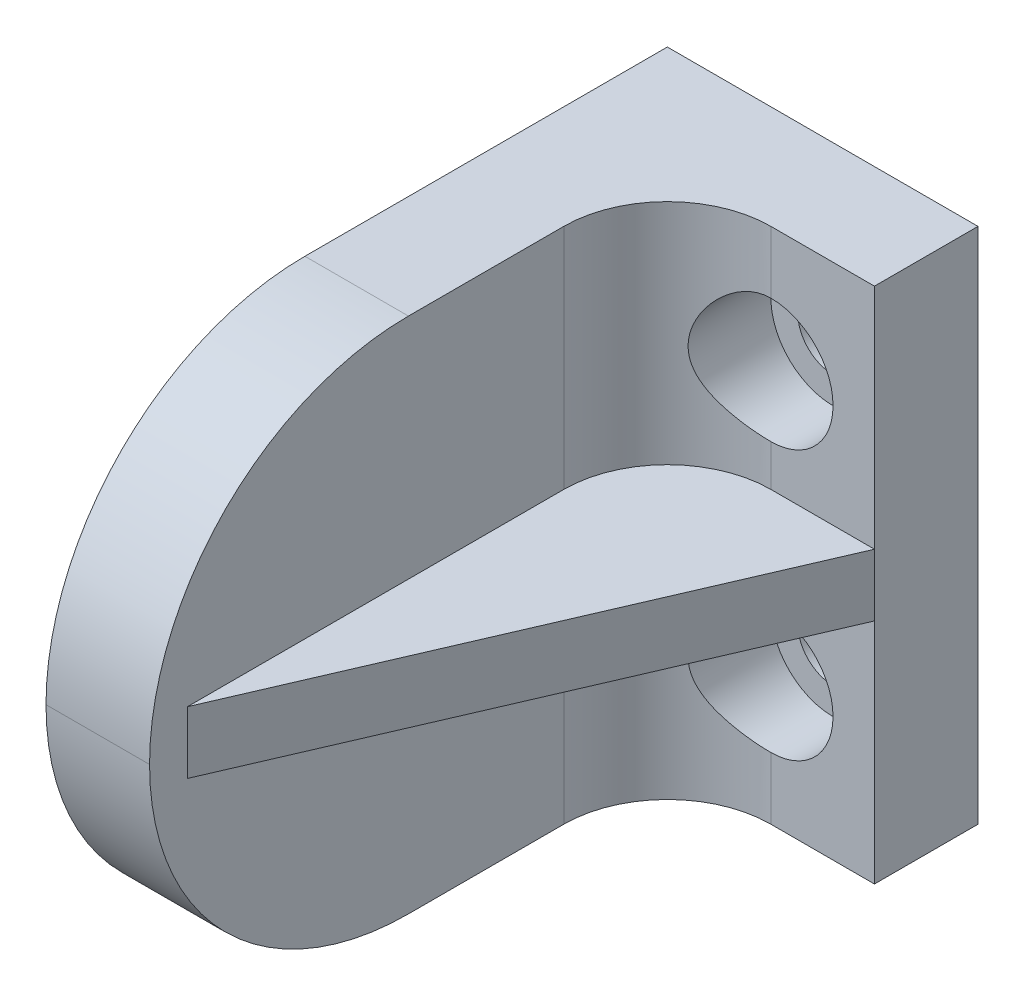
ISO-10303-21;
HEADER;
FILE_DESCRIPTION(('STEP AP214'),'2;1');
FILE_NAME('part.step','',(''),(''),'','','');
FILE_SCHEMA(('AUTOMOTIVE_DESIGN { 1 0 10303 214 1 1 1 1 }'));
ENDSEC;
DATA;
#1=APPLICATION_CONTEXT('core data for automotive mechanical design processes');
#2=APPLICATION_PROTOCOL_DEFINITION('international standard','automotive_design',2000,#1);
#3=PRODUCT_CONTEXT('',#1,'mechanical');
#4=PRODUCT('Part','Part','',(#3));
#5=PRODUCT_RELATED_PRODUCT_CATEGORY('part','',(#4));
#6=PRODUCT_DEFINITION_FORMATION('','',#4);
#7=PRODUCT_DEFINITION_CONTEXT('part definition',#1,'design');
#8=PRODUCT_DEFINITION('design','',#6,#7);
#9=PRODUCT_DEFINITION_SHAPE('','',#8);
#10=(LENGTH_UNIT() NAMED_UNIT(*) SI_UNIT(.MILLI.,.METRE.));
#11=(NAMED_UNIT(*) PLANE_ANGLE_UNIT() SI_UNIT($,.RADIAN.));
#12=(NAMED_UNIT(*) SI_UNIT($,.STERADIAN.) SOLID_ANGLE_UNIT());
#13=UNCERTAINTY_MEASURE_WITH_UNIT(LENGTH_MEASURE(1.E-05),#10,'distance_accuracy_value','');
#14=(GEOMETRIC_REPRESENTATION_CONTEXT(3) GLOBAL_UNCERTAINTY_ASSIGNED_CONTEXT((#13)) GLOBAL_UNIT_ASSIGNED_CONTEXT((#10,
#11,#12)) REPRESENTATION_CONTEXT('',''));
#15=CARTESIAN_POINT('',(0.,0.,0.));
#16=DIRECTION('',(0.,0.,1.));
#17=DIRECTION('',(1.,0.,0.));
#18=AXIS2_PLACEMENT_3D('',#15,#16,#17);
#19=CARTESIAN_POINT('',(0.,0.,5.));
#20=DIRECTION('',(0.,0.,1.));
#21=DIRECTION('',(1.,0.,0.));
#22=AXIS2_PLACEMENT_3D('',#19,#20,#21);
#23=PLANE('',#22);
#24=DIRECTION('',(1.,0.,0.));
#25=VECTOR('',#24,1.);
#26=CARTESIAN_POINT('',(7.05085742582333E-13,221.923622409626,5.));
#27=LINE('',#26,#25);
#28=CARTESIAN_POINT('',(259.023766162715,221.923622409625,5.));
#29=VERTEX_POINT('',#28);
#30=CARTESIAN_POINT('',(264.023766162715,221.923622409625,5.));
#31=VERTEX_POINT('',#30);
#32=EDGE_CURVE('E314',#29,#31,#27,.T.);
#33=ORIENTED_EDGE('',*,*,#32,.F.);
#34=DIRECTION('',(0.,-1.,0.));
#35=VECTOR('',#34,1.);
#36=CARTESIAN_POINT('',(259.023766162715,0.,5.));
#37=LINE('',#36,#35);
#38=CARTESIAN_POINT('',(259.023766162715,219.923622409626,5.));
#39=VERTEX_POINT('',#38);
#40=EDGE_CURVE('E235',#29,#39,#37,.T.);
#41=ORIENTED_EDGE('',*,*,#40,.T.);
#42=CARTESIAN_POINT('',(259.023766162715,216.923622409626,5.));
#43=DIRECTION('',(0.,0.,1.));
#44=DIRECTION('',(1.,0.,0.));
#45=AXIS2_PLACEMENT_3D('',#42,#43,#44);
#46=CIRCLE('',#45,2.99999999999999);
#47=CARTESIAN_POINT('',(259.023766162715,213.923622409626,5.));
#48=VERTEX_POINT('',#47);
#49=EDGE_CURVE('E348',#48,#39,#46,.T.);
#50=ORIENTED_EDGE('',*,*,#49,.F.);
#51=DIRECTION('',(0.,-1.,0.));
#52=VECTOR('',#51,1.);
#53=CARTESIAN_POINT('',(259.023766162715,0.,5.));
#54=LINE('',#53,#52);
#55=CARTESIAN_POINT('',(259.023766162715,210.923622409626,5.));
#56=VERTEX_POINT('',#55);
#57=EDGE_CURVE('E52',#48,#56,#54,.T.);
#58=ORIENTED_EDGE('',*,*,#57,.T.);
#59=DIRECTION('',(-1.,0.,0.));
#60=VECTOR('',#59,1.);
#61=CARTESIAN_POINT('',(0.,210.923622409626,5.));
#62=LINE('',#61,#60);
#63=CARTESIAN_POINT('',(264.023766162715,210.923622409626,5.));
#64=VERTEX_POINT('',#63);
#65=EDGE_CURVE('E182',#64,#56,#62,.T.);
#66=ORIENTED_EDGE('',*,*,#65,.F.);
#67=DIRECTION('',(0.,1.,0.));
#68=VECTOR('',#67,1.);
#69=CARTESIAN_POINT('',(264.023766162715,0.,5.));
#70=LINE('',#69,#68);
#71=EDGE_CURVE('E186',#64,#31,#70,.T.);
#72=ORIENTED_EDGE('',*,*,#71,.T.);
#73=EDGE_LOOP('',(#33,#41,#50,#58,#66,#72));
#74=FACE_BOUND('',#73,.T.);
#75=ADVANCED_FACE('F36',(#74),#23,.T.);
#76=CARTESIAN_POINT('',(259.023766162715,216.923622409626,5.));
#77=DIRECTION('',(0.,0.,-1.));
#78=DIRECTION('',(-1.,0.,0.));
#79=AXIS2_PLACEMENT_3D('',#76,#77,#78);
#80=CYLINDRICAL_SURFACE('',#79,1.69999999999996);
#81=CARTESIAN_POINT('',(259.023766162715,216.923622409626,0.));
#82=DIRECTION('',(0.,0.,1.));
#83=DIRECTION('',(1.,0.,0.));
#84=AXIS2_PLACEMENT_3D('',#81,#82,#83);
#85=CIRCLE('',#84,1.69999999999996);
#86=CARTESIAN_POINT('',(260.723766162715,216.923622409626,0.));
#87=VERTEX_POINT('',#86);
#88=EDGE_CURVE('E154',#87,#87,#85,.T.);
#89=ORIENTED_EDGE('',*,*,#88,.F.);
#90=EDGE_LOOP('',(#89));
#91=FACE_BOUND('',#90,.T.);
#92=CARTESIAN_POINT('',(259.023766162715,216.923622409626,2.));
#93=DIRECTION('',(0.,0.,1.));
#94=DIRECTION('',(1.,0.,0.));
#95=AXIS2_PLACEMENT_3D('',#92,#93,#94);
#96=CIRCLE('',#95,1.69999999999996);
#97=CARTESIAN_POINT('',(260.723766162715,216.923622409626,2.));
#98=VERTEX_POINT('',#97);
#99=EDGE_CURVE('E202',#98,#98,#96,.T.);
#100=ORIENTED_EDGE('',*,*,#99,.T.);
#101=EDGE_LOOP('',(#100));
#102=FACE_BOUND('',#101,.T.);
#103=ADVANCED_FACE('F270',(#91,#102),#80,.F.);
#104=CARTESIAN_POINT('',(259.023766162715,229.923622409626,5.));
#105=DIRECTION('',(0.,0.,-1.));
#106=DIRECTION('',(-1.,0.,0.));
#107=AXIS2_PLACEMENT_3D('',#104,#105,#106);
#108=CYLINDRICAL_SURFACE('',#107,1.69999999999996);
#109=CARTESIAN_POINT('',(259.023766162715,229.923622409626,0.));
#110=DIRECTION('',(0.,0.,1.));
#111=DIRECTION('',(1.,0.,0.));
#112=AXIS2_PLACEMENT_3D('',#109,#110,#111);
#113=CIRCLE('',#112,1.69999999999996);
#114=CARTESIAN_POINT('',(260.723766162715,229.923622409626,0.));
#115=VERTEX_POINT('',#114);
#116=EDGE_CURVE('E163',#115,#115,#113,.T.);
#117=ORIENTED_EDGE('',*,*,#116,.F.);
#118=EDGE_LOOP('',(#117));
#119=FACE_BOUND('',#118,.T.);
#120=CARTESIAN_POINT('',(259.023766162715,229.923622409626,2.));
#121=DIRECTION('',(0.,0.,1.));
#122=DIRECTION('',(1.,0.,0.));
#123=AXIS2_PLACEMENT_3D('',#120,#121,#122);
#124=CIRCLE('',#123,1.69999999999996);
#125=CARTESIAN_POINT('',(260.723766162715,229.923622409626,2.));
#126=VERTEX_POINT('',#125);
#127=EDGE_CURVE('E199',#126,#126,#124,.T.);
#128=ORIENTED_EDGE('',*,*,#127,.T.);
#129=EDGE_LOOP('',(#128));
#130=FACE_BOUND('',#129,.T.);
#131=ADVANCED_FACE('F267',(#119,#130),#108,.F.);
#132=CARTESIAN_POINT('',(0.,235.923622409626,5.));
#133=DIRECTION('',(0.,-1.,0.));
#134=DIRECTION('',(0.,0.,-1.));
#135=AXIS2_PLACEMENT_3D('',#132,#133,#134);
#136=PLANE('',#135);
#137=DIRECTION('',(0.,0.,1.));
#138=VECTOR('',#137,1.);
#139=CARTESIAN_POINT('',(249.023766162715,235.923622409626,0.));
#140=LINE('',#139,#138);
#141=CARTESIAN_POINT('',(249.023766162715,235.923622409626,0.));
#142=VERTEX_POINT('',#141);
#143=CARTESIAN_POINT('',(249.023766162715,235.923622409626,17.5));
#144=VERTEX_POINT('',#143);
#145=EDGE_CURVE('E146',#142,#144,#140,.T.);
#146=ORIENTED_EDGE('',*,*,#145,.T.);
#147=DIRECTION('',(1.,0.,0.));
#148=VECTOR('',#147,1.);
#149=CARTESIAN_POINT('',(254.023766162715,235.923622409626,17.5));
#150=LINE('',#149,#148);
#151=CARTESIAN_POINT('',(254.023766162715,235.923622409626,17.5));
#152=VERTEX_POINT('',#151);
#153=EDGE_CURVE('E216',#144,#152,#150,.T.);
#154=ORIENTED_EDGE('',*,*,#153,.T.);
#155=DIRECTION('',(0.,0.,1.));
#156=VECTOR('',#155,1.);
#157=CARTESIAN_POINT('',(254.023766162715,235.923622409626,0.));
#158=LINE('',#157,#156);
#159=CARTESIAN_POINT('',(254.023766162715,235.923622409626,10.));
#160=VERTEX_POINT('',#159);
#161=EDGE_CURVE('E170',#160,#152,#158,.T.);
#162=ORIENTED_EDGE('',*,*,#161,.F.);
#163=CARTESIAN_POINT('',(259.023766162715,235.923622409626,10.));
#164=DIRECTION('',(0.,-1.,0.));
#165=DIRECTION('',(0.,0.,-1.));
#166=AXIS2_PLACEMENT_3D('',#163,#164,#165);
#167=CIRCLE('',#166,5.);
#168=CARTESIAN_POINT('',(259.023766162715,235.923622409626,5.));
#169=VERTEX_POINT('',#168);
#170=EDGE_CURVE('E246',#160,#169,#167,.T.);
#171=ORIENTED_EDGE('',*,*,#170,.T.);
#172=DIRECTION('',(-1.,0.,0.));
#173=VECTOR('',#172,1.);
#174=CARTESIAN_POINT('',(0.,235.923622409626,5.));
#175=LINE('',#174,#173);
#176=CARTESIAN_POINT('',(264.023766162715,235.923622409626,5.));
#177=VERTEX_POINT('',#176);
#178=EDGE_CURVE('E179',#177,#169,#175,.T.);
#179=ORIENTED_EDGE('',*,*,#178,.F.);
#180=DIRECTION('',(0.,0.,-1.));
#181=VECTOR('',#180,1.);
#182=CARTESIAN_POINT('',(264.023766162715,235.923622409626,5.));
#183=LINE('',#182,#181);
#184=CARTESIAN_POINT('',(264.023766162715,235.923622409626,0.));
#185=VERTEX_POINT('',#184);
#186=EDGE_CURVE('E150',#177,#185,#183,.T.);
#187=ORIENTED_EDGE('',*,*,#186,.T.);
#188=DIRECTION('',(-1.,0.,0.));
#189=VECTOR('',#188,1.);
#190=CARTESIAN_POINT('',(0.,235.923622409626,0.));
#191=LINE('',#190,#189);
#192=EDGE_CURVE('E141',#185,#142,#191,.T.);
#193=ORIENTED_EDGE('',*,*,#192,.T.);
#194=EDGE_LOOP('',(#146,#154,#162,#171,#179,#187,#193));
#195=FACE_BOUND('',#194,.T.);
#196=ADVANCED_FACE('F143',(#195),#136,.F.);
#197=CARTESIAN_POINT('',(0.,210.923622409626,5.));
#198=DIRECTION('',(0.,-1.,0.));
#199=DIRECTION('',(0.,0.,-1.));
#200=AXIS2_PLACEMENT_3D('',#197,#198,#199);
#201=PLANE('',#200);
#202=DIRECTION('',(0.,0.,-1.));
#203=VECTOR('',#202,1.);
#204=CARTESIAN_POINT('',(254.023766162715,210.923622409626,0.));
#205=LINE('',#204,#203);
#206=CARTESIAN_POINT('',(254.023766162715,210.923622409626,17.5));
#207=VERTEX_POINT('',#206);
#208=CARTESIAN_POINT('',(254.023766162715,210.923622409626,10.));
#209=VERTEX_POINT('',#208);
#210=EDGE_CURVE('E174',#207,#209,#205,.T.);
#211=ORIENTED_EDGE('',*,*,#210,.F.);
#212=DIRECTION('',(1.,0.,0.));
#213=VECTOR('',#212,1.);
#214=CARTESIAN_POINT('',(0.,210.923622409626,17.5));
#215=LINE('',#214,#213);
#216=CARTESIAN_POINT('',(249.023766162715,210.923622409626,17.5));
#217=VERTEX_POINT('',#216);
#218=EDGE_CURVE('E210',#207,#217,#215,.F.);
#219=ORIENTED_EDGE('',*,*,#218,.T.);
#220=DIRECTION('',(0.,0.,-1.));
#221=VECTOR('',#220,1.);
#222=CARTESIAN_POINT('',(249.023766162715,210.923622409626,0.));
#223=LINE('',#222,#221);
#224=CARTESIAN_POINT('',(249.023766162715,210.923622409626,0.));
#225=VERTEX_POINT('',#224);
#226=EDGE_CURVE('E168',#217,#225,#223,.T.);
#227=ORIENTED_EDGE('',*,*,#226,.T.);
#228=DIRECTION('',(-1.,0.,0.));
#229=VECTOR('',#228,1.);
#230=CARTESIAN_POINT('',(0.,210.923622409626,0.));
#231=LINE('',#230,#229);
#232=CARTESIAN_POINT('',(264.023766162715,210.923622409626,0.));
#233=VERTEX_POINT('',#232);
#234=EDGE_CURVE('E153',#233,#225,#231,.T.);
#235=ORIENTED_EDGE('',*,*,#234,.F.);
#236=DIRECTION('',(0.,0.,-1.));
#237=VECTOR('',#236,1.);
#238=CARTESIAN_POINT('',(264.023766162715,210.923622409626,5.));
#239=LINE('',#238,#237);
#240=EDGE_CURVE('E196',#64,#233,#239,.T.);
#241=ORIENTED_EDGE('',*,*,#240,.F.);
#242=ORIENTED_EDGE('',*,*,#65,.T.);
#243=CARTESIAN_POINT('',(259.023766162715,210.923622409626,10.));
#244=DIRECTION('',(0.,-1.,0.));
#245=DIRECTION('',(0.,0.,-1.));
#246=AXIS2_PLACEMENT_3D('',#243,#244,#245);
#247=CIRCLE('',#246,5.);
#248=EDGE_CURVE('E11',#56,#209,#247,.F.);
#249=ORIENTED_EDGE('',*,*,#248,.T.);
#250=EDGE_LOOP('',(#211,#219,#227,#235,#241,#242,#249));
#251=FACE_BOUND('',#250,.T.);
#252=ADVANCED_FACE('F277',(#251),#201,.T.);
#253=CARTESIAN_POINT('',(264.023766162715,0.,5.));
#254=DIRECTION('',(-1.,0.,0.));
#255=DIRECTION('',(0.,0.,1.));
#256=AXIS2_PLACEMENT_3D('',#253,#254,#255);
#257=PLANE('',#256);
#258=DIRECTION('',(0.,1.,0.));
#259=VECTOR('',#258,1.);
#260=CARTESIAN_POINT('',(264.023766162715,0.,0.));
#261=LINE('',#260,#259);
#262=EDGE_CURVE('E183',#233,#185,#261,.T.);
#263=ORIENTED_EDGE('',*,*,#262,.T.);
#264=ORIENTED_EDGE('',*,*,#186,.F.);
#265=CARTESIAN_POINT('',(264.023766162715,224.923622409625,5.));
#266=VERTEX_POINT('',#265);
#267=EDGE_CURVE('E185',#266,#177,#70,.T.);
#268=ORIENTED_EDGE('',*,*,#267,.F.);
#269=DIRECTION('',(0.,-1.,0.));
#270=VECTOR('',#269,1.);
#271=CARTESIAN_POINT('',(264.023766162714,224.923622409625,5.));
#272=LINE('',#271,#270);
#273=EDGE_CURVE('E363',#266,#31,#272,.T.);
#274=ORIENTED_EDGE('',*,*,#273,.T.);
#275=ORIENTED_EDGE('',*,*,#71,.F.);
#276=ORIENTED_EDGE('',*,*,#240,.T.);
#277=EDGE_LOOP('',(#263,#264,#268,#274,#275,#276));
#278=FACE_BOUND('',#277,.T.);
#279=ADVANCED_FACE('F280',(#278),#257,.F.);
#280=ORIENTED_EDGE('',*,*,#178,.T.);
#281=DIRECTION('',(0.,-1.,0.));
#282=VECTOR('',#281,1.);
#283=CARTESIAN_POINT('',(259.023766162715,0.,5.));
#284=LINE('',#283,#282);
#285=CARTESIAN_POINT('',(259.023766162715,232.923622409626,5.));
#286=VERTEX_POINT('',#285);
#287=EDGE_CURVE('E225',#169,#286,#284,.T.);
#288=ORIENTED_EDGE('',*,*,#287,.T.);
#289=CARTESIAN_POINT('',(259.023766162715,229.923622409626,5.));
#290=DIRECTION('',(0.,0.,1.));
#291=DIRECTION('',(1.,0.,0.));
#292=AXIS2_PLACEMENT_3D('',#289,#290,#291);
#293=CIRCLE('',#292,2.99999999999999);
#294=CARTESIAN_POINT('',(259.023766162715,226.923622409626,5.));
#295=VERTEX_POINT('',#294);
#296=EDGE_CURVE('E222',#295,#286,#293,.T.);
#297=ORIENTED_EDGE('',*,*,#296,.F.);
#298=DIRECTION('',(0.,-1.,0.));
#299=VECTOR('',#298,1.);
#300=CARTESIAN_POINT('',(259.023766162715,0.,5.));
#301=LINE('',#300,#299);
#302=CARTESIAN_POINT('',(259.023766162715,224.923622409625,5.));
#303=VERTEX_POINT('',#302);
#304=EDGE_CURVE('E218',#295,#303,#301,.T.);
#305=ORIENTED_EDGE('',*,*,#304,.T.);
#306=DIRECTION('',(1.,0.,0.));
#307=VECTOR('',#306,1.);
#308=CARTESIAN_POINT('',(7.13412415267022E-13,224.923622409626,5.));
#309=LINE('',#308,#307);
#310=EDGE_CURVE('E364',#303,#266,#309,.T.);
#311=ORIENTED_EDGE('',*,*,#310,.T.);
#312=ORIENTED_EDGE('',*,*,#267,.T.);
#313=EDGE_LOOP('',(#280,#288,#297,#305,#311,#312));
#314=FACE_BOUND('',#313,.T.);
#315=ADVANCED_FACE('F284',(#314),#23,.T.);
#316=CARTESIAN_POINT('',(0.,0.,0.));
#317=DIRECTION('',(0.,0.,1.));
#318=DIRECTION('',(1.,0.,0.));
#319=AXIS2_PLACEMENT_3D('',#316,#317,#318);
#320=PLANE('',#319);
#321=ORIENTED_EDGE('',*,*,#116,.T.);
#322=EDGE_LOOP('',(#321));
#323=FACE_BOUND('',#322,.T.);
#324=ORIENTED_EDGE('',*,*,#88,.T.);
#325=EDGE_LOOP('',(#324));
#326=FACE_BOUND('',#325,.T.);
#327=ORIENTED_EDGE('',*,*,#192,.F.);
#328=ORIENTED_EDGE('',*,*,#262,.F.);
#329=ORIENTED_EDGE('',*,*,#234,.T.);
#330=DIRECTION('',(0.,-1.,0.));
#331=VECTOR('',#330,1.);
#332=CARTESIAN_POINT('',(249.023766162715,0.,0.));
#333=LINE('',#332,#331);
#334=EDGE_CURVE('E158',#142,#225,#333,.T.);
#335=ORIENTED_EDGE('',*,*,#334,.F.);
#336=EDGE_LOOP('',(#327,#328,#329,#335));
#337=FACE_BOUND('',#336,.T.);
#338=ADVANCED_FACE('F159',(#323,#326,#337),#320,.F.);
#339=CARTESIAN_POINT('',(249.023766162715,0.,0.));
#340=DIRECTION('',(-1.,0.,0.));
#341=DIRECTION('',(0.,0.,1.));
#342=AXIS2_PLACEMENT_3D('',#339,#340,#341);
#343=PLANE('',#342);
#344=CARTESIAN_POINT('',(249.023766162715,223.423622409626,17.5));
#345=DIRECTION('',(-1.,0.,0.));
#346=DIRECTION('',(0.,0.,1.));
#347=AXIS2_PLACEMENT_3D('',#344,#345,#346);
#348=CIRCLE('',#347,3.95);
#349=CARTESIAN_POINT('',(249.023766162715,223.423622409626,21.45));
#350=VERTEX_POINT('',#349);
#351=EDGE_CURVE('E198',#350,#350,#348,.T.);
#352=ORIENTED_EDGE('',*,*,#351,.F.);
#353=EDGE_LOOP('',(#352));
#354=FACE_BOUND('',#353,.T.);
#355=ORIENTED_EDGE('',*,*,#226,.F.);
#356=CARTESIAN_POINT('',(249.023766162715,223.423622409626,17.5));
#357=DIRECTION('',(-1.,0.,0.));
#358=DIRECTION('',(0.,0.,1.));
#359=AXIS2_PLACEMENT_3D('',#356,#357,#358);
#360=CIRCLE('',#359,12.5);
#361=CARTESIAN_POINT('',(249.023766162715,223.423622409626,30.));
#362=VERTEX_POINT('',#361);
#363=EDGE_CURVE('E214',#217,#362,#360,.T.);
#364=ORIENTED_EDGE('',*,*,#363,.T.);
#365=CARTESIAN_POINT('',(249.023766162715,223.423622409626,17.5));
#366=DIRECTION('',(-1.,0.,0.));
#367=DIRECTION('',(0.,0.,1.));
#368=AXIS2_PLACEMENT_3D('',#365,#366,#367);
#369=CIRCLE('',#368,12.5);
#370=EDGE_CURVE('E167',#362,#144,#369,.T.);
#371=ORIENTED_EDGE('',*,*,#370,.T.);
#372=ORIENTED_EDGE('',*,*,#145,.F.);
#373=ORIENTED_EDGE('',*,*,#334,.T.);
#374=EDGE_LOOP('',(#355,#364,#371,#372,#373));
#375=FACE_BOUND('',#374,.T.);
#376=ADVANCED_FACE('F165',(#354,#375),#343,.T.);
#377=CARTESIAN_POINT('',(254.023766162715,0.,0.));
#378=DIRECTION('',(-1.,0.,0.));
#379=DIRECTION('',(0.,0.,1.));
#380=AXIS2_PLACEMENT_3D('',#377,#378,#379);
#381=PLANE('',#380);
#382=DIRECTION('',(0.,0.,-1.));
#383=VECTOR('',#382,1.);
#384=CARTESIAN_POINT('',(254.023766162714,224.923622409625,-1.12825866943706E-12));
#385=LINE('',#384,#383);
#386=CARTESIAN_POINT('',(254.023766162715,224.923622409625,28.1700361998964));
#387=VERTEX_POINT('',#386);
#388=CARTESIAN_POINT('',(254.023766162715,224.923622409625,10.));
#389=VERTEX_POINT('',#388);
#390=EDGE_CURVE('E321',#387,#389,#385,.T.);
#391=ORIENTED_EDGE('',*,*,#390,.T.);
#392=DIRECTION('',(0.,-1.,0.));
#393=VECTOR('',#392,1.);
#394=CARTESIAN_POINT('',(254.023766162715,0.,10.));
#395=LINE('',#394,#393);
#396=EDGE_CURVE('E232',#389,#160,#395,.F.);
#397=ORIENTED_EDGE('',*,*,#396,.T.);
#398=ORIENTED_EDGE('',*,*,#161,.T.);
#399=CARTESIAN_POINT('',(254.023766162715,223.423622409626,17.5));
#400=DIRECTION('',(-1.,0.,0.));
#401=DIRECTION('',(0.,0.,1.));
#402=AXIS2_PLACEMENT_3D('',#399,#400,#401);
#403=CIRCLE('',#402,12.5);
#404=CARTESIAN_POINT('',(254.023766162715,223.423622409626,30.));
#405=VERTEX_POINT('',#404);
#406=EDGE_CURVE('E206',#152,#405,#403,.F.);
#407=ORIENTED_EDGE('',*,*,#406,.T.);
#408=CARTESIAN_POINT('',(254.023766162715,223.423622409626,17.5));
#409=DIRECTION('',(-1.,0.,0.));
#410=DIRECTION('',(0.,0.,1.));
#411=AXIS2_PLACEMENT_3D('',#408,#409,#410);
#412=CIRCLE('',#411,12.5);
#413=EDGE_CURVE('E208',#405,#207,#412,.F.);
#414=ORIENTED_EDGE('',*,*,#413,.T.);
#415=ORIENTED_EDGE('',*,*,#210,.T.);
#416=DIRECTION('',(0.,-1.,0.));
#417=VECTOR('',#416,1.);
#418=CARTESIAN_POINT('',(254.023766162715,0.,10.));
#419=LINE('',#418,#417);
#420=CARTESIAN_POINT('',(254.023766162715,221.923622409625,10.));
#421=VERTEX_POINT('',#420);
#422=EDGE_CURVE('E230',#209,#421,#419,.F.);
#423=ORIENTED_EDGE('',*,*,#422,.T.);
#424=DIRECTION('',(0.,0.,-1.));
#425=VECTOR('',#424,1.);
#426=CARTESIAN_POINT('',(254.023766162714,221.923622409625,-1.12792560252967E-12));
#427=LINE('',#426,#425);
#428=CARTESIAN_POINT('',(254.023766162715,221.923622409625,28.1700361998965));
#429=VERTEX_POINT('',#428);
#430=EDGE_CURVE('E367',#429,#421,#427,.T.);
#431=ORIENTED_EDGE('',*,*,#430,.F.);
#432=DIRECTION('',(0.,-1.,0.));
#433=VECTOR('',#432,1.);
#434=CARTESIAN_POINT('',(254.023766162715,224.923622409625,28.1700361998965));
#435=LINE('',#434,#433);
#436=EDGE_CURVE('E223',#387,#429,#435,.T.);
#437=ORIENTED_EDGE('',*,*,#436,.F.);
#438=EDGE_LOOP('',(#391,#397,#398,#407,#414,#415,#423,#431,#437));
#439=FACE_BOUND('',#438,.T.);
#440=ADVANCED_FACE('F292',(#439),#381,.F.);
#441=CARTESIAN_POINT('',(246.023766162715,223.423622409626,17.5));
#442=DIRECTION('',(1.,0.,0.));
#443=DIRECTION('',(0.,0.,-1.));
#444=AXIS2_PLACEMENT_3D('',#441,#442,#443);
#445=CYLINDRICAL_SURFACE('',#444,3.95);
#446=CARTESIAN_POINT('',(246.023766162715,223.423622409626,17.5));
#447=DIRECTION('',(-1.,0.,0.));
#448=DIRECTION('',(0.,0.,1.));
#449=AXIS2_PLACEMENT_3D('',#446,#447,#448);
#450=CIRCLE('',#449,3.95);
#451=CARTESIAN_POINT('',(246.023766162715,223.423622409626,21.45));
#452=VERTEX_POINT('',#451);
#453=EDGE_CURVE('E177',#452,#452,#450,.T.);
#454=ORIENTED_EDGE('',*,*,#453,.F.);
#455=EDGE_LOOP('',(#454));
#456=FACE_BOUND('',#455,.T.);
#457=ORIENTED_EDGE('',*,*,#351,.T.);
#458=EDGE_LOOP('',(#457));
#459=FACE_BOUND('',#458,.T.);
#460=ADVANCED_FACE('F295',(#456,#459),#445,.T.);
#461=CARTESIAN_POINT('',(246.023766162715,223.423622409626,17.5));
#462=DIRECTION('',(-1.,0.,0.));
#463=DIRECTION('',(0.,0.,1.));
#464=AXIS2_PLACEMENT_3D('',#461,#462,#463);
#465=PLANE('',#464);
#466=ORIENTED_EDGE('',*,*,#453,.T.);
#467=EDGE_LOOP('',(#466));
#468=FACE_BOUND('',#467,.T.);
#469=ADVANCED_FACE('F301',(#468),#465,.T.);
#470=CARTESIAN_POINT('',(259.023766162715,229.923622409626,2.));
#471=DIRECTION('',(0.,0.,1.));
#472=DIRECTION('',(1.,0.,0.));
#473=AXIS2_PLACEMENT_3D('',#470,#471,#472);
#474=CYLINDRICAL_SURFACE('',#473,2.99999999999999);
#475=CARTESIAN_POINT('',(259.023766162715,229.923622409626,2.));
#476=DIRECTION('',(0.,0.,1.));
#477=DIRECTION('',(1.,0.,0.));
#478=AXIS2_PLACEMENT_3D('',#475,#476,#477);
#479=CIRCLE('',#478,2.99999999999999);
#480=CARTESIAN_POINT('',(262.023766162715,229.923622409626,2.));
#481=VERTEX_POINT('',#480);
#482=EDGE_CURVE('E347',#481,#481,#479,.T.);
#483=ORIENTED_EDGE('',*,*,#482,.F.);
#484=EDGE_LOOP('',(#483));
#485=FACE_BOUND('',#484,.T.);
#486=ORIENTED_EDGE('',*,*,#296,.T.);
#487=CARTESIAN_POINT('',(259.023766162715,232.923622409626,5.));
#488=CARTESIAN_POINT('',(258.946624756492,232.923636433156,4.99998449974798));
#489=CARTESIAN_POINT('',(258.869493722489,232.920647453485,5.00178479770903));
#490=CARTESIAN_POINT('',(258.715888032982,232.908772294223,5.00890006592572));
#491=CARTESIAN_POINT('',(258.639413065961,232.899889090568,5.01421326254887));
#492=CARTESIAN_POINT('',(258.488094623517,232.87639905823,5.02819893959118));
#493=CARTESIAN_POINT('',(258.413244475333,232.861824073575,5.03685272723138));
#494=CARTESIAN_POINT('',(258.265287587973,232.827153218464,5.05729858201319));
#495=CARTESIAN_POINT('',(258.192180994065,232.807056889724,5.06909090965844));
#496=CARTESIAN_POINT('',(257.976450410635,232.738901527764,5.10874169398059));
#497=CARTESIAN_POINT('',(257.837027909881,232.682914512187,5.14091184003935));
#498=CARTESIAN_POINT('',(257.569867301342,232.552004741189,5.21403575831872));
#499=CARTESIAN_POINT('',(257.442143318214,232.477059495855,5.2549999540144));
#500=CARTESIAN_POINT('',(257.191162428382,232.304066107249,5.3458964271067));
#501=CARTESIAN_POINT('',(257.068977817349,232.20469745389,5.39627310050566));
#502=CARTESIAN_POINT('',(256.841980064357,231.988666547922,5.49940089777047));
#503=CARTESIAN_POINT('',(256.737186370905,231.871985206722,5.55215459721195));
#504=CARTESIAN_POINT('',(256.534866303787,231.607774875538,5.66177887304915));
#505=CARTESIAN_POINT('',(256.439810094708,231.458217499191,5.71836016321839));
#506=CARTESIAN_POINT('',(256.276536611578,231.141927657046,5.82123442387609));
#507=CARTESIAN_POINT('',(256.208275530755,230.975223791666,5.86754413276821));
#508=CARTESIAN_POINT('',(256.114954424018,230.670430393171,5.93290721609474));
#509=CARTESIAN_POINT('',(256.083442644909,230.535152222897,5.95584203159037));
#510=CARTESIAN_POINT('',(256.039442877334,230.260016845129,5.9881937068567));
#511=CARTESIAN_POINT('',(256.026931488438,230.120165487177,5.99762719371798));
#512=CARTESIAN_POINT('',(256.021655981733,229.83959911355,6.00158155528717));
#513=CARTESIAN_POINT('',(256.028930523773,229.698882943841,5.99607323516619));
#514=CARTESIAN_POINT('',(256.062845072449,229.421064258237,5.97093468556534));
#515=CARTESIAN_POINT('',(256.08949956096,229.2839645242,5.95129389555772));
#516=CARTESIAN_POINT('',(256.160287848099,229.018561418604,5.90093616502502));
#517=CARTESIAN_POINT('',(256.204191480665,228.890167317147,5.87036553299475));
#518=CARTESIAN_POINT('',(256.307865439146,228.642231492022,5.80145867323278));
#519=CARTESIAN_POINT('',(256.367641459272,228.522692965011,5.76311965976932));
#520=CARTESIAN_POINT('',(256.513404080607,228.273658021849,5.67489480136976));
#521=CARTESIAN_POINT('',(256.602145842371,228.146073529073,5.62416202376032));
#522=CARTESIAN_POINT('',(256.79793915626,227.906275587903,5.52139087810577));
#523=CARTESIAN_POINT('',(256.905009228261,227.794077895718,5.4693512353708));
#524=CARTESIAN_POINT('',(257.152158320379,227.572379600361,5.36128158314197));
#525=CARTESIAN_POINT('',(257.294758479091,227.465438643825,5.30570762428974));
#526=CARTESIAN_POINT('',(257.599276811017,227.277351590671,5.20453702535037));
#527=CARTESIAN_POINT('',(257.761178820578,227.196184116773,5.1589321264686));
#528=CARTESIAN_POINT('',(258.067161217718,227.076438728231,5.09036079401617));
#529=CARTESIAN_POINT('',(258.20861776427,227.032656252971,5.06472021909609));
#530=CARTESIAN_POINT('',(258.497898089024,226.966368722223,5.02560393109959));
#531=CARTESIAN_POINT('',(258.645705508115,226.943812067531,5.01209872101553));
#532=CARTESIAN_POINT('',(258.832596422789,226.929472761735,5.0035078755964));
#533=CARTESIAN_POINT('',(258.87080362597,226.927278925798,5.00219294777007));
#534=CARTESIAN_POINT('',(258.947257863328,226.924355570066,5.0004402411883));
#535=CARTESIAN_POINT('',(258.985504825469,226.923624664857,5.00000163254782));
#536=CARTESIAN_POINT('',(259.023766162715,226.923622409626,5.));
#537=B_SPLINE_CURVE_WITH_KNOTS('',3,(#487,#488,#489,#490,#491,#492,#493,#494,#495,#496,#497,
#498,#499,#500,#501,#502,#503,#504,#505,#506,#507,#508,#509,#510,#511,#512,#513,#514,#515,#516,
#517,#518,#519,#520,#521,#522,#523,#524,#525,#526,#527,#528,#529,#530,#531,#532,#533,#534,#535,
#536),.UNSPECIFIED.,.F.,.F.,(4,2,2,2,2,2,2,2,2,2,2,2,2,2,2,2,2,2,2,2,2,2,2,2,4),(0.,
0.231328240228338,0.462539773905591,0.692475856222502,0.922431029541946,1.38117325985717,
1.8404622636027,2.33456219846001,2.82921102203627,3.38456472801069,3.93900667869512,
4.35955966268455,4.7795942823362,5.2004501993958,5.62162092924991,6.03735282155262,
6.45323405946914,6.94181209449755,7.43088676014273,7.98818745066573,8.54502468491721,
8.99398548375872,9.44185203395278,9.55670668456519,9.67145251475945),.UNSPECIFIED.);
#538=EDGE_CURVE('E239',#286,#295,#537,.T.);
#539=ORIENTED_EDGE('',*,*,#538,.T.);
#540=EDGE_LOOP('',(#486,#539));
#541=FACE_BOUND('',#540,.T.);
#542=ADVANCED_FACE('F247',(#485,#541),#474,.F.);
#543=CARTESIAN_POINT('',(259.023766162715,229.923622409626,2.));
#544=DIRECTION('',(0.,0.,1.));
#545=DIRECTION('',(1.,0.,0.));
#546=AXIS2_PLACEMENT_3D('',#543,#544,#545);
#547=PLANE('',#546);
#548=ORIENTED_EDGE('',*,*,#127,.F.);
#549=EDGE_LOOP('',(#548));
#550=FACE_BOUND('',#549,.T.);
#551=ORIENTED_EDGE('',*,*,#482,.T.);
#552=EDGE_LOOP('',(#551));
#553=FACE_BOUND('',#552,.T.);
#554=ADVANCED_FACE('F308',(#550,#553),#547,.T.);
#555=CARTESIAN_POINT('',(259.023766162715,216.923622409626,2.));
#556=DIRECTION('',(0.,0.,1.));
#557=DIRECTION('',(1.,0.,0.));
#558=AXIS2_PLACEMENT_3D('',#555,#556,#557);
#559=CYLINDRICAL_SURFACE('',#558,2.99999999999999);
#560=CARTESIAN_POINT('',(259.023766162715,216.923622409626,2.));
#561=DIRECTION('',(0.,0.,1.));
#562=DIRECTION('',(1.,0.,0.));
#563=AXIS2_PLACEMENT_3D('',#560,#561,#562);
#564=CIRCLE('',#563,2.99999999999999);
#565=CARTESIAN_POINT('',(262.023766162715,216.923622409626,2.));
#566=VERTEX_POINT('',#565);
#567=EDGE_CURVE('E203',#566,#566,#564,.T.);
#568=ORIENTED_EDGE('',*,*,#567,.F.);
#569=EDGE_LOOP('',(#568));
#570=FACE_BOUND('',#569,.T.);
#571=ORIENTED_EDGE('',*,*,#49,.T.);
#572=CARTESIAN_POINT('',(259.023766162715,219.923622409626,5.));
#573=CARTESIAN_POINT('',(258.946624756492,219.923636433156,4.99998449974798));
#574=CARTESIAN_POINT('',(258.869493722489,219.920647453485,5.00178479770903));
#575=CARTESIAN_POINT('',(258.715888032982,219.908772294223,5.00890006592572));
#576=CARTESIAN_POINT('',(258.639413065961,219.899889090568,5.01421326254887));
#577=CARTESIAN_POINT('',(258.488094623517,219.87639905823,5.02819893959118));
#578=CARTESIAN_POINT('',(258.413244475333,219.861824073575,5.03685272723138));
#579=CARTESIAN_POINT('',(258.265287587973,219.827153218464,5.05729858201319));
#580=CARTESIAN_POINT('',(258.192180994065,219.807056889724,5.06909090965844));
#581=CARTESIAN_POINT('',(257.976450410635,219.738901527764,5.10874169398059));
#582=CARTESIAN_POINT('',(257.837027909881,219.682914512187,5.14091184003935));
#583=CARTESIAN_POINT('',(257.569867301342,219.552004741189,5.21403575831872));
#584=CARTESIAN_POINT('',(257.442143318214,219.477059495855,5.2549999540144));
#585=CARTESIAN_POINT('',(257.191162428382,219.304066107249,5.3458964271067));
#586=CARTESIAN_POINT('',(257.068977817349,219.20469745389,5.39627310050566));
#587=CARTESIAN_POINT('',(256.841980064357,218.988666547922,5.49940089777047));
#588=CARTESIAN_POINT('',(256.737186370905,218.871985206722,5.55215459721195));
#589=CARTESIAN_POINT('',(256.534866303787,218.607774875538,5.66177887304915));
#590=CARTESIAN_POINT('',(256.439810094708,218.458217499191,5.71836016321839));
#591=CARTESIAN_POINT('',(256.276536611578,218.141927657046,5.82123442387609));
#592=CARTESIAN_POINT('',(256.208275530755,217.975223791666,5.86754413276821));
#593=CARTESIAN_POINT('',(256.114954424018,217.670430393171,5.93290721609474));
#594=CARTESIAN_POINT('',(256.083442644909,217.535152222897,5.95584203159037));
#595=CARTESIAN_POINT('',(256.039442877334,217.260016845129,5.9881937068567));
#596=CARTESIAN_POINT('',(256.026931488438,217.120165487177,5.99762719371798));
#597=CARTESIAN_POINT('',(256.021655981733,216.83959911355,6.00158155528717));
#598=CARTESIAN_POINT('',(256.028930523773,216.698882943841,5.99607323516619));
#599=CARTESIAN_POINT('',(256.062845072449,216.421064258237,5.97093468556534));
#600=CARTESIAN_POINT('',(256.08949956096,216.283964524199,5.95129389555771));
#601=CARTESIAN_POINT('',(256.160287848099,216.018561418604,5.90093616502502));
#602=CARTESIAN_POINT('',(256.204191480665,215.890167317147,5.87036553299476));
#603=CARTESIAN_POINT('',(256.307865439146,215.642231492022,5.80145867323279));
#604=CARTESIAN_POINT('',(256.367641459272,215.522692965011,5.76311965976932));
#605=CARTESIAN_POINT('',(256.513404080607,215.273658021849,5.67489480136976));
#606=CARTESIAN_POINT('',(256.602145842371,215.146073529073,5.62416202376032));
#607=CARTESIAN_POINT('',(256.79793915626,214.906275587903,5.52139087810577));
#608=CARTESIAN_POINT('',(256.905009228261,214.794077895718,5.4693512353708));
#609=CARTESIAN_POINT('',(257.152158320379,214.572379600361,5.36128158314197));
#610=CARTESIAN_POINT('',(257.294758479091,214.465438643825,5.30570762428974));
#611=CARTESIAN_POINT('',(257.599276811017,214.277351590671,5.20453702535037));
#612=CARTESIAN_POINT('',(257.761178820578,214.196184116773,5.1589321264686));
#613=CARTESIAN_POINT('',(258.067161217718,214.076438728231,5.09036079401617));
#614=CARTESIAN_POINT('',(258.20861776427,214.032656252971,5.06472021909609));
#615=CARTESIAN_POINT('',(258.497898089024,213.966368722223,5.02560393109959));
#616=CARTESIAN_POINT('',(258.645705508115,213.943812067531,5.01209872101553));
#617=CARTESIAN_POINT('',(258.832596422789,213.929472761735,5.0035078755964));
#618=CARTESIAN_POINT('',(258.87080362597,213.927278925798,5.00219294777007));
#619=CARTESIAN_POINT('',(258.947257863328,213.924355570066,5.0004402411883));
#620=CARTESIAN_POINT('',(258.985504825469,213.923624664857,5.00000163254782));
#621=CARTESIAN_POINT('',(259.023766162715,213.923622409626,5.));
#622=B_SPLINE_CURVE_WITH_KNOTS('',3,(#572,#573,#574,#575,#576,#577,#578,#579,#580,#581,#582,
#583,#584,#585,#586,#587,#588,#589,#590,#591,#592,#593,#594,#595,#596,#597,#598,#599,#600,#601,
#602,#603,#604,#605,#606,#607,#608,#609,#610,#611,#612,#613,#614,#615,#616,#617,#618,#619,#620,
#621),.UNSPECIFIED.,.F.,.F.,(4,2,2,2,2,2,2,2,2,2,2,2,2,2,2,2,2,2,2,2,2,2,2,2,4),(0.,
0.231328240228338,0.462539773905591,0.692475856222502,0.922431029541946,1.38117325985717,
1.8404622636027,2.33456219846001,2.82921102203627,3.38456472801069,3.93900667869512,
4.35955966268455,4.7795942823362,5.20045019939583,5.62162092924991,6.03735282155262,
6.45323405946914,6.94181209449757,7.43088676014273,7.98818745066573,8.54502468491722,
8.99398548375873,9.44185203395278,9.5567066845652,9.67145251475945),.UNSPECIFIED.);
#623=EDGE_CURVE('E45',#39,#48,#622,.T.);
#624=ORIENTED_EDGE('',*,*,#623,.T.);
#625=EDGE_LOOP('',(#571,#624));
#626=FACE_BOUND('',#625,.T.);
#627=ADVANCED_FACE('F333',(#570,#626),#559,.F.);
#628=CARTESIAN_POINT('',(259.023766162715,216.923622409626,2.));
#629=DIRECTION('',(0.,0.,1.));
#630=DIRECTION('',(1.,0.,0.));
#631=AXIS2_PLACEMENT_3D('',#628,#629,#630);
#632=PLANE('',#631);
#633=ORIENTED_EDGE('',*,*,#99,.F.);
#634=EDGE_LOOP('',(#633));
#635=FACE_BOUND('',#634,.T.);
#636=ORIENTED_EDGE('',*,*,#567,.T.);
#637=EDGE_LOOP('',(#636));
#638=FACE_BOUND('',#637,.T.);
#639=ADVANCED_FACE('F261',(#635,#638),#632,.T.);
#640=CARTESIAN_POINT('',(0.,223.423622409626,17.5));
#641=DIRECTION('',(-1.,0.,0.));
#642=DIRECTION('',(0.,0.,1.));
#643=AXIS2_PLACEMENT_3D('',#640,#641,#642);
#644=CYLINDRICAL_SURFACE('',#643,12.5);
#645=ORIENTED_EDGE('',*,*,#153,.F.);
#646=ORIENTED_EDGE('',*,*,#370,.F.);
#647=DIRECTION('',(1.,0.,0.));
#648=VECTOR('',#647,1.);
#649=CARTESIAN_POINT('',(249.023766162715,223.423622409626,30.));
#650=LINE('',#649,#648);
#651=EDGE_CURVE('E219',#405,#362,#650,.F.);
#652=ORIENTED_EDGE('',*,*,#651,.F.);
#653=ORIENTED_EDGE('',*,*,#406,.F.);
#654=EDGE_LOOP('',(#645,#646,#652,#653));
#655=FACE_BOUND('',#654,.T.);
#656=ADVANCED_FACE('F257',(#655),#644,.T.);
#657=CARTESIAN_POINT('',(249.023766162715,223.423622409626,17.5));
#658=DIRECTION('',(1.,0.,0.));
#659=DIRECTION('',(0.,0.,-1.));
#660=AXIS2_PLACEMENT_3D('',#657,#658,#659);
#661=CYLINDRICAL_SURFACE('',#660,12.5);
#662=ORIENTED_EDGE('',*,*,#363,.F.);
#663=ORIENTED_EDGE('',*,*,#218,.F.);
#664=ORIENTED_EDGE('',*,*,#413,.F.);
#665=ORIENTED_EDGE('',*,*,#651,.T.);
#666=EDGE_LOOP('',(#662,#663,#664,#665));
#667=FACE_BOUND('',#666,.T.);
#668=ADVANCED_FACE('F260',(#667),#661,.T.);
#669=CARTESIAN_POINT('',(224.385151238011,224.923622409625,96.8428142719138));
#670=DIRECTION('',(0.918137950182966,0.,0.396260904498312));
#671=DIRECTION('',(0.396260904498312,0.,-0.918137950182967));
#672=AXIS2_PLACEMENT_3D('',#669,#670,#671);
#673=PLANE('',#672);
#674=DIRECTION('',(-0.396260904498312,0.,0.918137950182966));
#675=VECTOR('',#674,1.);
#676=CARTESIAN_POINT('',(224.385151238011,221.923622409625,96.8428142719138));
#677=LINE('',#676,#675);
#678=EDGE_CURVE('E322',#31,#429,#677,.T.);
#679=ORIENTED_EDGE('',*,*,#678,.F.);
#680=ORIENTED_EDGE('',*,*,#273,.F.);
#681=DIRECTION('',(-0.396260904498312,0.,0.918137950182966));
#682=VECTOR('',#681,1.);
#683=CARTESIAN_POINT('',(224.385151238011,224.923622409625,96.8428142719138));
#684=LINE('',#683,#682);
#685=EDGE_CURVE('E370',#266,#387,#684,.T.);
#686=ORIENTED_EDGE('',*,*,#685,.T.);
#687=ORIENTED_EDGE('',*,*,#436,.T.);
#688=EDGE_LOOP('',(#679,#680,#686,#687));
#689=FACE_BOUND('',#688,.T.);
#690=ADVANCED_FACE('F265',(#689),#673,.T.);
#691=CARTESIAN_POINT('',(7.13412415267022E-13,224.923622409626,0.));
#692=DIRECTION('',(0.,1.,0.));
#693=DIRECTION('',(-1.,0.,0.));
#694=AXIS2_PLACEMENT_3D('',#691,#692,#693);
#695=PLANE('',#694);
#696=ORIENTED_EDGE('',*,*,#310,.F.);
#697=CARTESIAN_POINT('',(259.023766162715,224.923622409625,10.));
#698=DIRECTION('',(0.,1.,0.));
#699=DIRECTION('',(-1.,0.,0.));
#700=AXIS2_PLACEMENT_3D('',#697,#698,#699);
#701=CIRCLE('',#700,5.);
#702=EDGE_CURVE('E228',#303,#389,#701,.T.);
#703=ORIENTED_EDGE('',*,*,#702,.T.);
#704=ORIENTED_EDGE('',*,*,#390,.F.);
#705=ORIENTED_EDGE('',*,*,#685,.F.);
#706=EDGE_LOOP('',(#696,#703,#704,#705));
#707=FACE_BOUND('',#706,.T.);
#708=ADVANCED_FACE('F393',(#707),#695,.T.);
#709=CARTESIAN_POINT('',(7.05085742582333E-13,221.923622409626,0.));
#710=DIRECTION('',(0.,1.,0.));
#711=DIRECTION('',(-1.,0.,0.));
#712=AXIS2_PLACEMENT_3D('',#709,#710,#711);
#713=PLANE('',#712);
#714=ORIENTED_EDGE('',*,*,#430,.T.);
#715=CARTESIAN_POINT('',(259.023766162715,221.923622409625,10.));
#716=DIRECTION('',(0.,1.,0.));
#717=DIRECTION('',(-1.,0.,0.));
#718=AXIS2_PLACEMENT_3D('',#715,#716,#717);
#719=CIRCLE('',#718,5.);
#720=EDGE_CURVE('E60',#421,#29,#719,.F.);
#721=ORIENTED_EDGE('',*,*,#720,.T.);
#722=ORIENTED_EDGE('',*,*,#32,.T.);
#723=ORIENTED_EDGE('',*,*,#678,.T.);
#724=EDGE_LOOP('',(#714,#721,#722,#723));
#725=FACE_BOUND('',#724,.T.);
#726=ADVANCED_FACE('F255',(#725),#713,.F.);
#727=CARTESIAN_POINT('',(259.023766162715,0.,10.));
#728=DIRECTION('',(0.,-1.,0.));
#729=DIRECTION('',(0.,0.,-1.));
#730=AXIS2_PLACEMENT_3D('',#727,#728,#729);
#731=CYLINDRICAL_SURFACE('',#730,5.);
#732=ORIENTED_EDGE('',*,*,#170,.F.);
#733=ORIENTED_EDGE('',*,*,#396,.F.);
#734=ORIENTED_EDGE('',*,*,#702,.F.);
#735=ORIENTED_EDGE('',*,*,#304,.F.);
#736=ORIENTED_EDGE('',*,*,#538,.F.);
#737=ORIENTED_EDGE('',*,*,#287,.F.);
#738=EDGE_LOOP('',(#732,#733,#734,#735,#736,#737));
#739=FACE_BOUND('',#738,.T.);
#740=ADVANCED_FACE('F251',(#739),#731,.F.);
#741=CARTESIAN_POINT('',(259.023766162715,0.,10.));
#742=DIRECTION('',(0.,-1.,0.));
#743=DIRECTION('',(0.,0.,-1.));
#744=AXIS2_PLACEMENT_3D('',#741,#742,#743);
#745=CYLINDRICAL_SURFACE('',#744,5.);
#746=ORIENTED_EDGE('',*,*,#720,.F.);
#747=ORIENTED_EDGE('',*,*,#422,.F.);
#748=ORIENTED_EDGE('',*,*,#248,.F.);
#749=ORIENTED_EDGE('',*,*,#57,.F.);
#750=ORIENTED_EDGE('',*,*,#623,.F.);
#751=ORIENTED_EDGE('',*,*,#40,.F.);
#752=EDGE_LOOP('',(#746,#747,#748,#749,#750,#751));
#753=FACE_BOUND('',#752,.T.);
#754=ADVANCED_FACE('F38',(#753),#745,.F.);
#755=CLOSED_SHELL('',(#75,#103,#131,#196,#252,#279,#315,#338,#376,#440,#460,#469,#542,#554,#627,
#639,#656,#668,#690,#708,#726,#740,#754));
#756=MANIFOLD_SOLID_BREP('B2',#755);
#757=ADVANCED_BREP_SHAPE_REPRESENTATION('',(#18,#756),#14);
#758=SHAPE_DEFINITION_REPRESENTATION(#9,#757);
ENDSEC;
END-ISO-10303-21;
